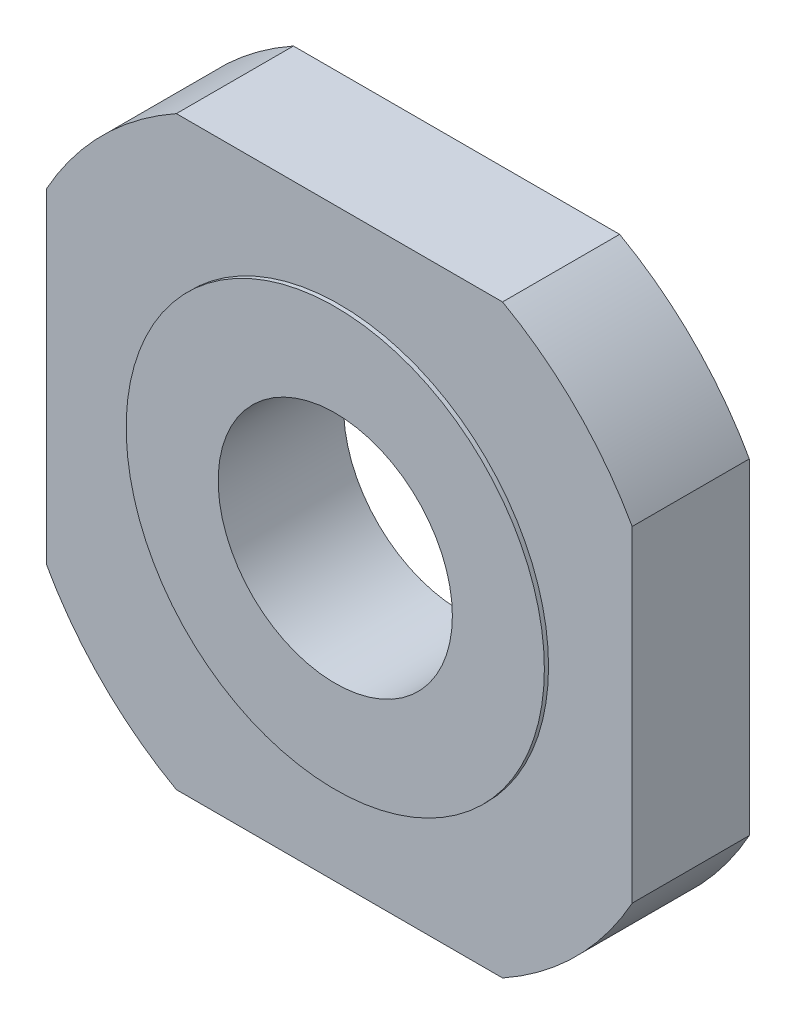
ISO-10303-21;
HEADER;
FILE_DESCRIPTION(('STEP AP214'),'2;1');
FILE_NAME('part.step','',(''),(''),'','','');
FILE_SCHEMA(('AUTOMOTIVE_DESIGN { 1 0 10303 214 1 1 1 1 }'));
ENDSEC;
DATA;
#1=APPLICATION_CONTEXT('core data for automotive mechanical design processes');
#2=APPLICATION_PROTOCOL_DEFINITION('international standard','automotive_design',2000,#1);
#3=PRODUCT_CONTEXT('',#1,'mechanical');
#4=PRODUCT('Part','Part','',(#3));
#5=PRODUCT_RELATED_PRODUCT_CATEGORY('part','',(#4));
#6=PRODUCT_DEFINITION_FORMATION('','',#4);
#7=PRODUCT_DEFINITION_CONTEXT('part definition',#1,'design');
#8=PRODUCT_DEFINITION('design','',#6,#7);
#9=PRODUCT_DEFINITION_SHAPE('','',#8);
#10=(LENGTH_UNIT() NAMED_UNIT(*) SI_UNIT(.MILLI.,.METRE.));
#11=(NAMED_UNIT(*) PLANE_ANGLE_UNIT() SI_UNIT($,.RADIAN.));
#12=(NAMED_UNIT(*) SI_UNIT($,.STERADIAN.) SOLID_ANGLE_UNIT());
#13=UNCERTAINTY_MEASURE_WITH_UNIT(LENGTH_MEASURE(1.E-05),#10,'distance_accuracy_value','');
#14=(GEOMETRIC_REPRESENTATION_CONTEXT(3) GLOBAL_UNCERTAINTY_ASSIGNED_CONTEXT((#13)) GLOBAL_UNIT_ASSIGNED_CONTEXT((#10,
#11,#12)) REPRESENTATION_CONTEXT('',''));
#15=CARTESIAN_POINT('',(0.,0.,0.));
#16=DIRECTION('',(0.,0.,1.));
#17=DIRECTION('',(1.,0.,0.));
#18=AXIS2_PLACEMENT_3D('',#15,#16,#17);
#19=CARTESIAN_POINT('',(-0.048207779633342,0.0482077796333455,7.));
#20=DIRECTION('',(0.,0.,1.));
#21=DIRECTION('',(1.,0.,0.));
#22=AXIS2_PLACEMENT_3D('',#19,#20,#21);
#23=PLANE('',#22);
#24=CARTESIAN_POINT('',(0.,0.,7.));
#25=DIRECTION('',(0.,0.,1.));
#26=DIRECTION('',(1.,0.,0.));
#27=AXIS2_PLACEMENT_3D('',#24,#25,#26);
#28=CIRCLE('',#27,25.);
#29=CARTESIAN_POINT('',(25.,0.,7.));
#30=VERTEX_POINT('',#29);
#31=EDGE_CURVE('E124',#30,#30,#28,.F.);
#32=ORIENTED_EDGE('',*,*,#31,.T.);
#33=EDGE_LOOP('',(#32));
#34=FACE_BOUND('',#33,.T.);
#35=CARTESIAN_POINT('',(-0.048207779633342,0.0482077796333455,7.));
#36=DIRECTION('',(0.,0.,1.));
#37=DIRECTION('',(1.,0.,0.));
#38=AXIS2_PLACEMENT_3D('',#35,#36,#37);
#39=CIRCLE('',#38,40.);
#40=CARTESIAN_POINT('',(-19.5,35.,7.));
#41=VERTEX_POINT('',#40);
#42=CARTESIAN_POINT('',(-35.,19.5,7.));
#43=VERTEX_POINT('',#42);
#44=EDGE_CURVE('E157',#41,#43,#39,.T.);
#45=ORIENTED_EDGE('',*,*,#44,.T.);
#46=DIRECTION('',(0.,-1.,0.));
#47=VECTOR('',#46,1.);
#48=CARTESIAN_POINT('',(-35.,-19.5,7.));
#49=LINE('',#48,#47);
#50=CARTESIAN_POINT('',(-35.,-19.5,7.));
#51=VERTEX_POINT('',#50);
#52=EDGE_CURVE('E183',#43,#51,#49,.T.);
#53=ORIENTED_EDGE('',*,*,#52,.T.);
#54=CARTESIAN_POINT('',(-0.048207779633349,-0.0482077796333559,7.));
#55=DIRECTION('',(0.,0.,1.));
#56=DIRECTION('',(1.,0.,0.));
#57=AXIS2_PLACEMENT_3D('',#54,#55,#56);
#58=CIRCLE('',#57,40.);
#59=CARTESIAN_POINT('',(-19.5,-35.,7.));
#60=VERTEX_POINT('',#59);
#61=EDGE_CURVE('E181',#51,#60,#58,.T.);
#62=ORIENTED_EDGE('',*,*,#61,.T.);
#63=DIRECTION('',(1.,0.,0.));
#64=VECTOR('',#63,1.);
#65=CARTESIAN_POINT('',(19.5,-35.,7.));
#66=LINE('',#65,#64);
#67=CARTESIAN_POINT('',(19.5,-35.,7.));
#68=VERTEX_POINT('',#67);
#69=EDGE_CURVE('E179',#60,#68,#66,.T.);
#70=ORIENTED_EDGE('',*,*,#69,.T.);
#71=CARTESIAN_POINT('',(0.048207779633349,-0.0482077796333559,7.));
#72=DIRECTION('',(0.,0.,1.));
#73=DIRECTION('',(1.,0.,0.));
#74=AXIS2_PLACEMENT_3D('',#71,#72,#73);
#75=CIRCLE('',#74,40.);
#76=CARTESIAN_POINT('',(35.,-19.5,7.));
#77=VERTEX_POINT('',#76);
#78=EDGE_CURVE('E177',#68,#77,#75,.T.);
#79=ORIENTED_EDGE('',*,*,#78,.T.);
#80=DIRECTION('',(0.,1.,0.));
#81=VECTOR('',#80,1.);
#82=CARTESIAN_POINT('',(35.,19.5,7.));
#83=LINE('',#82,#81);
#84=CARTESIAN_POINT('',(35.,19.5,7.));
#85=VERTEX_POINT('',#84);
#86=EDGE_CURVE('E175',#77,#85,#83,.T.);
#87=ORIENTED_EDGE('',*,*,#86,.T.);
#88=CARTESIAN_POINT('',(0.048207779633342,0.0482077796333455,7.));
#89=DIRECTION('',(0.,0.,1.));
#90=DIRECTION('',(-1.,0.,0.));
#91=AXIS2_PLACEMENT_3D('',#88,#89,#90);
#92=CIRCLE('',#91,40.);
#93=CARTESIAN_POINT('',(19.5,35.,7.));
#94=VERTEX_POINT('',#93);
#95=EDGE_CURVE('E173',#85,#94,#92,.T.);
#96=ORIENTED_EDGE('',*,*,#95,.T.);
#97=DIRECTION('',(-1.,0.,0.));
#98=VECTOR('',#97,1.);
#99=CARTESIAN_POINT('',(-19.5,35.,7.));
#100=LINE('',#99,#98);
#101=EDGE_CURVE('E154',#94,#41,#100,.T.);
#102=ORIENTED_EDGE('',*,*,#101,.T.);
#103=EDGE_LOOP('',(#45,#53,#62,#70,#79,#87,#96,#102));
#104=FACE_BOUND('',#103,.T.);
#105=ADVANCED_FACE('F37',(#34,#104),#23,.T.);
#106=CARTESIAN_POINT('',(-0.048207779633342,0.0482077796333455,-7.));
#107=DIRECTION('',(0.,0.,1.));
#108=DIRECTION('',(1.,0.,0.));
#109=AXIS2_PLACEMENT_3D('',#106,#107,#108);
#110=PLANE('',#109);
#111=CARTESIAN_POINT('',(0.,0.,-7.));
#112=DIRECTION('',(0.,0.,1.));
#113=DIRECTION('',(1.,0.,0.));
#114=AXIS2_PLACEMENT_3D('',#111,#112,#113);
#115=CIRCLE('',#114,25.);
#116=CARTESIAN_POINT('',(25.,0.,-7.));
#117=VERTEX_POINT('',#116);
#118=EDGE_CURVE('E11',#117,#117,#115,.F.);
#119=ORIENTED_EDGE('',*,*,#118,.F.);
#120=EDGE_LOOP('',(#119));
#121=FACE_BOUND('',#120,.T.);
#122=CARTESIAN_POINT('',(-0.048207779633342,0.0482077796333455,-7.));
#123=DIRECTION('',(0.,0.,1.));
#124=DIRECTION('',(1.,0.,0.));
#125=AXIS2_PLACEMENT_3D('',#122,#123,#124);
#126=CIRCLE('',#125,40.);
#127=CARTESIAN_POINT('',(-19.5,35.,-7.));
#128=VERTEX_POINT('',#127);
#129=CARTESIAN_POINT('',(-35.,19.5,-7.));
#130=VERTEX_POINT('',#129);
#131=EDGE_CURVE('E118',#128,#130,#126,.T.);
#132=ORIENTED_EDGE('',*,*,#131,.F.);
#133=DIRECTION('',(-1.,0.,0.));
#134=VECTOR('',#133,1.);
#135=CARTESIAN_POINT('',(-19.5,35.,-7.));
#136=LINE('',#135,#134);
#137=CARTESIAN_POINT('',(19.5,35.,-7.));
#138=VERTEX_POINT('',#137);
#139=EDGE_CURVE('E155',#138,#128,#136,.T.);
#140=ORIENTED_EDGE('',*,*,#139,.F.);
#141=CARTESIAN_POINT('',(0.048207779633342,0.0482077796333455,-7.));
#142=DIRECTION('',(0.,0.,1.));
#143=DIRECTION('',(-1.,0.,0.));
#144=AXIS2_PLACEMENT_3D('',#141,#142,#143);
#145=CIRCLE('',#144,40.);
#146=CARTESIAN_POINT('',(35.,19.5,-7.));
#147=VERTEX_POINT('',#146);
#148=EDGE_CURVE('E158',#147,#138,#145,.T.);
#149=ORIENTED_EDGE('',*,*,#148,.F.);
#150=DIRECTION('',(0.,1.,0.));
#151=VECTOR('',#150,1.);
#152=CARTESIAN_POINT('',(35.,19.5,-7.));
#153=LINE('',#152,#151);
#154=CARTESIAN_POINT('',(35.,-19.5,-7.));
#155=VERTEX_POINT('',#154);
#156=EDGE_CURVE('E160',#155,#147,#153,.T.);
#157=ORIENTED_EDGE('',*,*,#156,.F.);
#158=CARTESIAN_POINT('',(0.048207779633349,-0.0482077796333559,-7.));
#159=DIRECTION('',(0.,0.,1.));
#160=DIRECTION('',(1.,0.,0.));
#161=AXIS2_PLACEMENT_3D('',#158,#159,#160);
#162=CIRCLE('',#161,40.);
#163=CARTESIAN_POINT('',(19.5,-35.,-7.));
#164=VERTEX_POINT('',#163);
#165=EDGE_CURVE('E162',#164,#155,#162,.T.);
#166=ORIENTED_EDGE('',*,*,#165,.F.);
#167=DIRECTION('',(1.,0.,0.));
#168=VECTOR('',#167,1.);
#169=CARTESIAN_POINT('',(19.5,-35.,-7.));
#170=LINE('',#169,#168);
#171=CARTESIAN_POINT('',(-19.5,-35.,-7.));
#172=VERTEX_POINT('',#171);
#173=EDGE_CURVE('E164',#172,#164,#170,.T.);
#174=ORIENTED_EDGE('',*,*,#173,.F.);
#175=CARTESIAN_POINT('',(-0.048207779633349,-0.0482077796333559,-7.));
#176=DIRECTION('',(0.,0.,1.));
#177=DIRECTION('',(1.,0.,0.));
#178=AXIS2_PLACEMENT_3D('',#175,#176,#177);
#179=CIRCLE('',#178,40.);
#180=CARTESIAN_POINT('',(-35.,-19.5,-7.));
#181=VERTEX_POINT('',#180);
#182=EDGE_CURVE('E166',#181,#172,#179,.T.);
#183=ORIENTED_EDGE('',*,*,#182,.F.);
#184=DIRECTION('',(0.,-1.,0.));
#185=VECTOR('',#184,1.);
#186=CARTESIAN_POINT('',(-35.,-19.5,-7.));
#187=LINE('',#186,#185);
#188=EDGE_CURVE('E168',#130,#181,#187,.T.);
#189=ORIENTED_EDGE('',*,*,#188,.F.);
#190=EDGE_LOOP('',(#132,#140,#149,#157,#166,#174,#183,#189));
#191=FACE_BOUND('',#190,.T.);
#192=ADVANCED_FACE('F223',(#121,#191),#110,.F.);
#193=CARTESIAN_POINT('',(-0.048207779633342,0.0482077796333455,7.));
#194=DIRECTION('',(0.,0.,-1.));
#195=DIRECTION('',(-1.,0.,0.));
#196=AXIS2_PLACEMENT_3D('',#193,#194,#195);
#197=CYLINDRICAL_SURFACE('',#196,40.);
#198=ORIENTED_EDGE('',*,*,#131,.T.);
#199=DIRECTION('',(0.,0.,-1.));
#200=VECTOR('',#199,1.);
#201=CARTESIAN_POINT('',(-35.,19.5,7.));
#202=LINE('',#201,#200);
#203=EDGE_CURVE('E128',#43,#130,#202,.T.);
#204=ORIENTED_EDGE('',*,*,#203,.F.);
#205=ORIENTED_EDGE('',*,*,#44,.F.);
#206=DIRECTION('',(0.,0.,-1.));
#207=VECTOR('',#206,1.);
#208=CARTESIAN_POINT('',(-19.5,35.,7.));
#209=LINE('',#208,#207);
#210=EDGE_CURVE('E151',#41,#128,#209,.T.);
#211=ORIENTED_EDGE('',*,*,#210,.T.);
#212=EDGE_LOOP('',(#198,#204,#205,#211));
#213=FACE_BOUND('',#212,.T.);
#214=ADVANCED_FACE('F39',(#213),#197,.T.);
#215=CARTESIAN_POINT('',(-35.,-19.5,7.));
#216=DIRECTION('',(1.,0.,0.));
#217=DIRECTION('',(0.,0.,-1.));
#218=AXIS2_PLACEMENT_3D('',#215,#216,#217);
#219=PLANE('',#218);
#220=ORIENTED_EDGE('',*,*,#188,.T.);
#221=DIRECTION('',(0.,0.,-1.));
#222=VECTOR('',#221,1.);
#223=CARTESIAN_POINT('',(-35.,-19.5,7.));
#224=LINE('',#223,#222);
#225=EDGE_CURVE('E131',#51,#181,#224,.T.);
#226=ORIENTED_EDGE('',*,*,#225,.F.);
#227=ORIENTED_EDGE('',*,*,#52,.F.);
#228=ORIENTED_EDGE('',*,*,#203,.T.);
#229=EDGE_LOOP('',(#220,#226,#227,#228));
#230=FACE_BOUND('',#229,.T.);
#231=ADVANCED_FACE('F263',(#230),#219,.F.);
#232=CARTESIAN_POINT('',(-0.048207779633349,-0.0482077796333559,7.));
#233=DIRECTION('',(0.,0.,-1.));
#234=DIRECTION('',(-1.,0.,0.));
#235=AXIS2_PLACEMENT_3D('',#232,#233,#234);
#236=CYLINDRICAL_SURFACE('',#235,40.);
#237=ORIENTED_EDGE('',*,*,#182,.T.);
#238=DIRECTION('',(0.,0.,-1.));
#239=VECTOR('',#238,1.);
#240=CARTESIAN_POINT('',(-19.5,-35.,7.));
#241=LINE('',#240,#239);
#242=EDGE_CURVE('E136',#60,#172,#241,.T.);
#243=ORIENTED_EDGE('',*,*,#242,.F.);
#244=ORIENTED_EDGE('',*,*,#61,.F.);
#245=ORIENTED_EDGE('',*,*,#225,.T.);
#246=EDGE_LOOP('',(#237,#243,#244,#245));
#247=FACE_BOUND('',#246,.T.);
#248=ADVANCED_FACE('F260',(#247),#236,.T.);
#249=CARTESIAN_POINT('',(19.5,-35.,7.));
#250=DIRECTION('',(0.,1.,0.));
#251=DIRECTION('',(0.,0.,1.));
#252=AXIS2_PLACEMENT_3D('',#249,#250,#251);
#253=PLANE('',#252);
#254=ORIENTED_EDGE('',*,*,#173,.T.);
#255=DIRECTION('',(0.,0.,-1.));
#256=VECTOR('',#255,1.);
#257=CARTESIAN_POINT('',(19.5,-35.,7.));
#258=LINE('',#257,#256);
#259=EDGE_CURVE('E139',#68,#164,#258,.T.);
#260=ORIENTED_EDGE('',*,*,#259,.F.);
#261=ORIENTED_EDGE('',*,*,#69,.F.);
#262=ORIENTED_EDGE('',*,*,#242,.T.);
#263=EDGE_LOOP('',(#254,#260,#261,#262));
#264=FACE_BOUND('',#263,.T.);
#265=ADVANCED_FACE('F256',(#264),#253,.F.);
#266=CARTESIAN_POINT('',(0.048207779633349,-0.0482077796333559,7.));
#267=DIRECTION('',(0.,0.,-1.));
#268=DIRECTION('',(-1.,0.,0.));
#269=AXIS2_PLACEMENT_3D('',#266,#267,#268);
#270=CYLINDRICAL_SURFACE('',#269,40.);
#271=ORIENTED_EDGE('',*,*,#165,.T.);
#272=DIRECTION('',(0.,0.,-1.));
#273=VECTOR('',#272,1.);
#274=CARTESIAN_POINT('',(35.,-19.5,7.));
#275=LINE('',#274,#273);
#276=EDGE_CURVE('E142',#77,#155,#275,.T.);
#277=ORIENTED_EDGE('',*,*,#276,.F.);
#278=ORIENTED_EDGE('',*,*,#78,.F.);
#279=ORIENTED_EDGE('',*,*,#259,.T.);
#280=EDGE_LOOP('',(#271,#277,#278,#279));
#281=FACE_BOUND('',#280,.T.);
#282=ADVANCED_FACE('F252',(#281),#270,.T.);
#283=CARTESIAN_POINT('',(35.,19.5,7.));
#284=DIRECTION('',(-1.,0.,0.));
#285=DIRECTION('',(0.,0.,1.));
#286=AXIS2_PLACEMENT_3D('',#283,#284,#285);
#287=PLANE('',#286);
#288=ORIENTED_EDGE('',*,*,#156,.T.);
#289=DIRECTION('',(0.,0.,-1.));
#290=VECTOR('',#289,1.);
#291=CARTESIAN_POINT('',(35.,19.5,7.));
#292=LINE('',#291,#290);
#293=EDGE_CURVE('E145',#85,#147,#292,.T.);
#294=ORIENTED_EDGE('',*,*,#293,.F.);
#295=ORIENTED_EDGE('',*,*,#86,.F.);
#296=ORIENTED_EDGE('',*,*,#276,.T.);
#297=EDGE_LOOP('',(#288,#294,#295,#296));
#298=FACE_BOUND('',#297,.T.);
#299=ADVANCED_FACE('F248',(#298),#287,.F.);
#300=CARTESIAN_POINT('',(0.048207779633342,0.0482077796333455,7.));
#301=DIRECTION('',(0.,0.,-1.));
#302=DIRECTION('',(-1.,0.,0.));
#303=AXIS2_PLACEMENT_3D('',#300,#301,#302);
#304=CYLINDRICAL_SURFACE('',#303,40.);
#305=ORIENTED_EDGE('',*,*,#148,.T.);
#306=DIRECTION('',(0.,0.,-1.));
#307=VECTOR('',#306,1.);
#308=CARTESIAN_POINT('',(19.5,35.,7.));
#309=LINE('',#308,#307);
#310=EDGE_CURVE('E148',#94,#138,#309,.T.);
#311=ORIENTED_EDGE('',*,*,#310,.F.);
#312=ORIENTED_EDGE('',*,*,#95,.F.);
#313=ORIENTED_EDGE('',*,*,#293,.T.);
#314=EDGE_LOOP('',(#305,#311,#312,#313));
#315=FACE_BOUND('',#314,.T.);
#316=ADVANCED_FACE('F244',(#315),#304,.T.);
#317=CARTESIAN_POINT('',(-19.5,35.,7.));
#318=DIRECTION('',(0.,-1.,0.));
#319=DIRECTION('',(0.,0.,-1.));
#320=AXIS2_PLACEMENT_3D('',#317,#318,#319);
#321=PLANE('',#320);
#322=ORIENTED_EDGE('',*,*,#139,.T.);
#323=ORIENTED_EDGE('',*,*,#210,.F.);
#324=ORIENTED_EDGE('',*,*,#101,.F.);
#325=ORIENTED_EDGE('',*,*,#310,.T.);
#326=EDGE_LOOP('',(#322,#323,#324,#325));
#327=FACE_BOUND('',#326,.T.);
#328=ADVANCED_FACE('F218',(#327),#321,.F.);
#329=CARTESIAN_POINT('',(0.,0.,7.5));
#330=DIRECTION('',(0.,0.,-1.));
#331=DIRECTION('',(-1.,0.,0.));
#332=AXIS2_PLACEMENT_3D('',#329,#330,#331);
#333=CYLINDRICAL_SURFACE('',#332,25.);
#334=CARTESIAN_POINT('',(0.,0.,-7.5));
#335=DIRECTION('',(0.,0.,1.));
#336=DIRECTION('',(1.,0.,0.));
#337=AXIS2_PLACEMENT_3D('',#334,#335,#336);
#338=CIRCLE('',#337,25.);
#339=CARTESIAN_POINT('',(25.,0.,-7.5));
#340=VERTEX_POINT('',#339);
#341=EDGE_CURVE('E192',#340,#340,#338,.T.);
#342=ORIENTED_EDGE('',*,*,#341,.T.);
#343=EDGE_LOOP('',(#342));
#344=FACE_BOUND('',#343,.T.);
#345=ORIENTED_EDGE('',*,*,#118,.T.);
#346=EDGE_LOOP('',(#345));
#347=FACE_BOUND('',#346,.T.);
#348=ADVANCED_FACE('F208',(#344,#347),#333,.T.);
#349=CARTESIAN_POINT('',(0.,0.,7.5));
#350=DIRECTION('',(0.,0.,1.));
#351=DIRECTION('',(1.,0.,0.));
#352=AXIS2_PLACEMENT_3D('',#349,#350,#351);
#353=PLANE('',#352);
#354=CARTESIAN_POINT('',(0.,0.,7.5));
#355=DIRECTION('',(0.,0.,1.));
#356=DIRECTION('',(1.,0.,0.));
#357=AXIS2_PLACEMENT_3D('',#354,#355,#356);
#358=CIRCLE('',#357,25.);
#359=CARTESIAN_POINT('',(25.,0.,7.5));
#360=VERTEX_POINT('',#359);
#361=EDGE_CURVE('E191',#360,#360,#358,.T.);
#362=ORIENTED_EDGE('',*,*,#361,.T.);
#363=EDGE_LOOP('',(#362));
#364=FACE_BOUND('',#363,.T.);
#365=CARTESIAN_POINT('',(0.,0.,7.5));
#366=DIRECTION('',(0.,0.,1.));
#367=DIRECTION('',(1.,0.,0.));
#368=AXIS2_PLACEMENT_3D('',#365,#366,#367);
#369=CIRCLE('',#368,14.);
#370=CARTESIAN_POINT('',(14.,0.,7.5));
#371=VERTEX_POINT('',#370);
#372=EDGE_CURVE('E195',#371,#371,#369,.T.);
#373=ORIENTED_EDGE('',*,*,#372,.F.);
#374=EDGE_LOOP('',(#373));
#375=FACE_BOUND('',#374,.T.);
#376=ADVANCED_FACE('F205',(#364,#375),#353,.T.);
#377=CARTESIAN_POINT('',(0.,0.,-7.5));
#378=DIRECTION('',(0.,0.,1.));
#379=DIRECTION('',(1.,0.,0.));
#380=AXIS2_PLACEMENT_3D('',#377,#378,#379);
#381=PLANE('',#380);
#382=ORIENTED_EDGE('',*,*,#341,.F.);
#383=EDGE_LOOP('',(#382));
#384=FACE_BOUND('',#383,.T.);
#385=CARTESIAN_POINT('',(0.,0.,-7.5));
#386=DIRECTION('',(0.,0.,1.));
#387=DIRECTION('',(1.,0.,0.));
#388=AXIS2_PLACEMENT_3D('',#385,#386,#387);
#389=CIRCLE('',#388,14.);
#390=CARTESIAN_POINT('',(14.,0.,-7.5));
#391=VERTEX_POINT('',#390);
#392=EDGE_CURVE('E198',#391,#391,#389,.T.);
#393=ORIENTED_EDGE('',*,*,#392,.T.);
#394=EDGE_LOOP('',(#393));
#395=FACE_BOUND('',#394,.T.);
#396=ADVANCED_FACE('F207',(#384,#395),#381,.F.);
#397=ORIENTED_EDGE('',*,*,#31,.F.);
#398=EDGE_LOOP('',(#397));
#399=FACE_BOUND('',#398,.T.);
#400=ORIENTED_EDGE('',*,*,#361,.F.);
#401=EDGE_LOOP('',(#400));
#402=FACE_BOUND('',#401,.T.);
#403=ADVANCED_FACE('F215',(#399,#402),#333,.T.);
#404=CARTESIAN_POINT('',(0.,0.,7.5));
#405=DIRECTION('',(0.,0.,-1.));
#406=DIRECTION('',(-1.,0.,0.));
#407=AXIS2_PLACEMENT_3D('',#404,#405,#406);
#408=CYLINDRICAL_SURFACE('',#407,14.);
#409=CARTESIAN_POINT('',(0.,0.,7.));
#410=DIRECTION('',(0.,0.,1.));
#411=DIRECTION('',(1.,0.,0.));
#412=AXIS2_PLACEMENT_3D('',#409,#410,#411);
#413=CIRCLE('',#412,14.);
#414=CARTESIAN_POINT('',(-9.92356948158019,9.87536170194541,7.));
#415=VERTEX_POINT('',#414);
#416=CARTESIAN_POINT('',(9.87536170194685,-9.92356948157877,7.));
#417=VERTEX_POINT('',#416);
#418=EDGE_CURVE('E121',#415,#417,#413,.F.);
#419=ORIENTED_EDGE('',*,*,#418,.T.);
#420=DIRECTION('',(0.,0.,-1.));
#421=VECTOR('',#420,1.);
#422=CARTESIAN_POINT('',(9.87536170194684,-9.92356948157877,0.));
#423=LINE('',#422,#421);
#424=CARTESIAN_POINT('',(9.87536170194685,-9.92356948157877,-7.));
#425=VERTEX_POINT('',#424);
#426=EDGE_CURVE('E45',#417,#425,#423,.T.);
#427=ORIENTED_EDGE('',*,*,#426,.T.);
#428=CARTESIAN_POINT('',(0.,0.,-7.));
#429=DIRECTION('',(0.,0.,1.));
#430=DIRECTION('',(1.,0.,0.));
#431=AXIS2_PLACEMENT_3D('',#428,#429,#430);
#432=CIRCLE('',#431,14.);
#433=CARTESIAN_POINT('',(-9.92356948158019,9.87536170194541,-7.));
#434=VERTEX_POINT('',#433);
#435=EDGE_CURVE('E51',#434,#425,#432,.F.);
#436=ORIENTED_EDGE('',*,*,#435,.F.);
#437=DIRECTION('',(0.,0.,-1.));
#438=VECTOR('',#437,1.);
#439=CARTESIAN_POINT('',(-9.92356948158019,9.87536170194541,0.));
#440=LINE('',#439,#438);
#441=EDGE_CURVE('E58',#434,#415,#440,.F.);
#442=ORIENTED_EDGE('',*,*,#441,.T.);
#443=EDGE_LOOP('',(#419,#427,#436,#442));
#444=FACE_BOUND('',#443,.T.);
#445=ORIENTED_EDGE('',*,*,#372,.T.);
#446=EDGE_LOOP('',(#445));
#447=FACE_BOUND('',#446,.T.);
#448=ORIENTED_EDGE('',*,*,#392,.F.);
#449=EDGE_LOOP('',(#448));
#450=FACE_BOUND('',#449,.T.);
#451=ADVANCED_FACE('F126',(#444,#447,#450),#408,.F.);
#452=CARTESIAN_POINT('',(-0.048207779633349,-0.0482077796333559,7.));
#453=DIRECTION('',(0.,0.,-1.));
#454=DIRECTION('',(-1.,0.,0.));
#455=AXIS2_PLACEMENT_3D('',#452,#453,#454);
#456=CYLINDRICAL_SURFACE('',#455,14.);
#457=ORIENTED_EDGE('',*,*,#426,.F.);
#458=CARTESIAN_POINT('',(-0.048207779633349,-0.0482077796333559,7.));
#459=DIRECTION('',(0.,0.,1.));
#460=DIRECTION('',(1.,0.,0.));
#461=AXIS2_PLACEMENT_3D('',#458,#459,#460);
#462=CIRCLE('',#461,14.);
#463=EDGE_CURVE('E112',#417,#415,#462,.T.);
#464=ORIENTED_EDGE('',*,*,#463,.T.);
#465=ORIENTED_EDGE('',*,*,#441,.F.);
#466=CARTESIAN_POINT('',(-0.048207779633349,-0.0482077796333559,-7.));
#467=DIRECTION('',(0.,0.,1.));
#468=DIRECTION('',(1.,0.,0.));
#469=AXIS2_PLACEMENT_3D('',#466,#467,#468);
#470=CIRCLE('',#469,14.);
#471=EDGE_CURVE('E119',#425,#434,#470,.T.);
#472=ORIENTED_EDGE('',*,*,#471,.F.);
#473=EDGE_LOOP('',(#457,#464,#465,#472));
#474=FACE_BOUND('',#473,.T.);
#475=ADVANCED_FACE('F114',(#474),#456,.F.);
#476=ORIENTED_EDGE('',*,*,#471,.T.);
#477=ORIENTED_EDGE('',*,*,#435,.T.);
#478=EDGE_LOOP('',(#476,#477));
#479=FACE_BOUND('',#478,.T.);
#480=ADVANCED_FACE('F231',(#479),#110,.F.);
#481=ORIENTED_EDGE('',*,*,#418,.F.);
#482=ORIENTED_EDGE('',*,*,#463,.F.);
#483=EDGE_LOOP('',(#481,#482));
#484=FACE_BOUND('',#483,.T.);
#485=ADVANCED_FACE('F122',(#484),#23,.T.);
#486=CLOSED_SHELL('',(#105,#192,#214,#231,#248,#265,#282,#299,#316,#328,#348,#376,#396,#403,
#451,#475,#480,#485));
#487=MANIFOLD_SOLID_BREP('B2',#486);
#488=ADVANCED_BREP_SHAPE_REPRESENTATION('',(#18,#487),#14);
#489=SHAPE_DEFINITION_REPRESENTATION(#9,#488);
ENDSEC;
END-ISO-10303-21;
